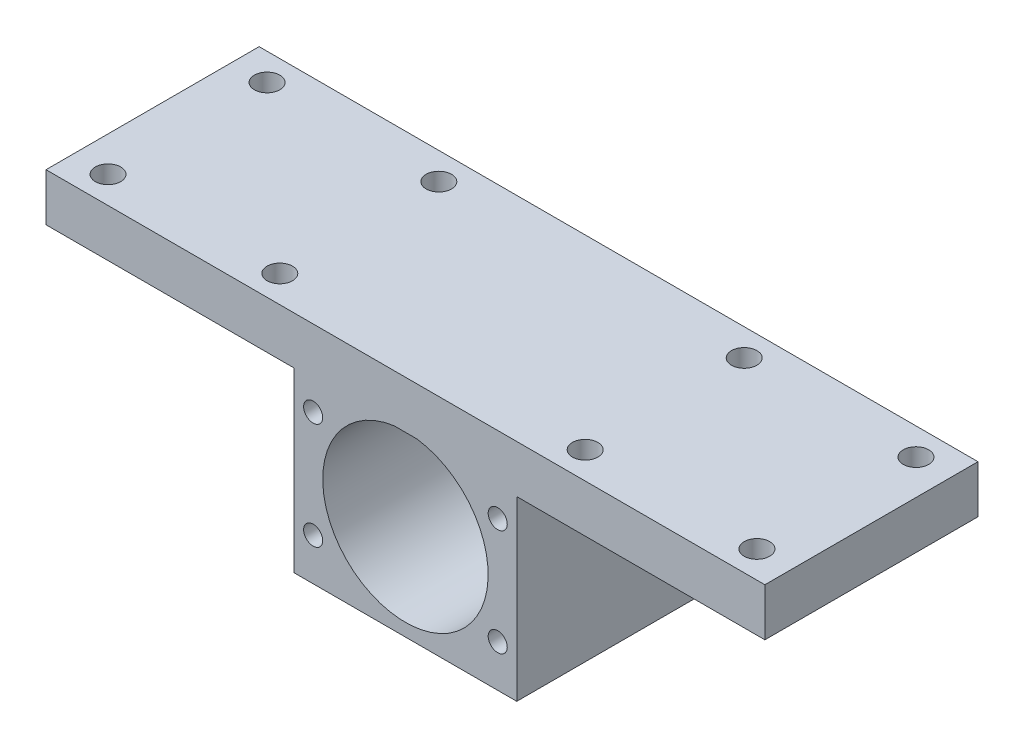
ISO-10303-21;
HEADER;
FILE_DESCRIPTION(('STEP AP214'),'2;1');
FILE_NAME('part.step','',(''),(''),'','','');
FILE_SCHEMA(('AUTOMOTIVE_DESIGN { 1 0 10303 214 1 1 1 1 }'));
ENDSEC;
DATA;
#1=APPLICATION_CONTEXT('core data for automotive mechanical design processes');
#2=APPLICATION_PROTOCOL_DEFINITION('international standard','automotive_design',2000,#1);
#3=PRODUCT_CONTEXT('',#1,'mechanical');
#4=PRODUCT('Part','Part','',(#3));
#5=PRODUCT_RELATED_PRODUCT_CATEGORY('part','',(#4));
#6=PRODUCT_DEFINITION_FORMATION('','',#4);
#7=PRODUCT_DEFINITION_CONTEXT('part definition',#1,'design');
#8=PRODUCT_DEFINITION('design','',#6,#7);
#9=PRODUCT_DEFINITION_SHAPE('','',#8);
#10=(LENGTH_UNIT() NAMED_UNIT(*) SI_UNIT(.MILLI.,.METRE.));
#11=(NAMED_UNIT(*) PLANE_ANGLE_UNIT() SI_UNIT($,.RADIAN.));
#12=(NAMED_UNIT(*) SI_UNIT($,.STERADIAN.) SOLID_ANGLE_UNIT());
#13=UNCERTAINTY_MEASURE_WITH_UNIT(LENGTH_MEASURE(1.E-05),#10,'distance_accuracy_value','');
#14=(GEOMETRIC_REPRESENTATION_CONTEXT(3) GLOBAL_UNCERTAINTY_ASSIGNED_CONTEXT((#13)) GLOBAL_UNIT_ASSIGNED_CONTEXT((#10,
#11,#12)) REPRESENTATION_CONTEXT('',''));
#15=CARTESIAN_POINT('',(0.,0.,0.));
#16=DIRECTION('',(0.,0.,1.));
#17=DIRECTION('',(1.,0.,0.));
#18=AXIS2_PLACEMENT_3D('',#15,#16,#17);
#19=CARTESIAN_POINT('',(0.,0.,0.));
#20=DIRECTION('',(0.,1.,0.));
#21=DIRECTION('',(0.,0.,1.));
#22=AXIS2_PLACEMENT_3D('',#19,#20,#21);
#23=PLANE('',#22);
#24=DIRECTION('',(0.,0.,1.));
#25=VECTOR('',#24,1.);
#26=CARTESIAN_POINT('',(-3.59687364248458,0.,-125.695444572929));
#27=LINE('',#26,#25);
#28=CARTESIAN_POINT('',(-3.59687364248458,0.,-33.5));
#29=VERTEX_POINT('',#28);
#30=CARTESIAN_POINT('',(-3.59687364248458,0.,33.5));
#31=VERTEX_POINT('',#30);
#32=EDGE_CURVE('E11',#29,#31,#27,.T.);
#33=ORIENTED_EDGE('',*,*,#32,.F.);
#34=DIRECTION('',(1.,0.,0.));
#35=VECTOR('',#34,1.);
#36=CARTESIAN_POINT('',(0.,0.,-33.5));
#37=LINE('',#36,#35);
#38=CARTESIAN_POINT('',(3.59687364248458,0.,-33.5));
#39=VERTEX_POINT('',#38);
#40=EDGE_CURVE('E58',#29,#39,#37,.T.);
#41=ORIENTED_EDGE('',*,*,#40,.T.);
#42=DIRECTION('',(0.,0.,1.));
#43=VECTOR('',#42,1.);
#44=CARTESIAN_POINT('',(3.59687364248458,0.,-125.695444572929));
#45=LINE('',#44,#43);
#46=CARTESIAN_POINT('',(3.59687364248458,0.,33.5));
#47=VERTEX_POINT('',#46);
#48=EDGE_CURVE('E51',#47,#39,#45,.F.);
#49=ORIENTED_EDGE('',*,*,#48,.F.);
#50=DIRECTION('',(-1.,0.,0.));
#51=VECTOR('',#50,1.);
#52=CARTESIAN_POINT('',(0.,0.,33.5));
#53=LINE('',#52,#51);
#54=EDGE_CURVE('E246',#47,#31,#53,.T.);
#55=ORIENTED_EDGE('',*,*,#54,.T.);
#56=EDGE_LOOP('',(#33,#41,#49,#55));
#57=FACE_BOUND('',#56,.T.);
#58=ADVANCED_FACE('F43',(#57),#23,.F.);
#59=CARTESIAN_POINT('',(102.,0.,-25.));
#60=DIRECTION('',(0.,1.,0.));
#61=DIRECTION('',(0.,0.,1.));
#62=AXIS2_PLACEMENT_3D('',#59,#60,#61);
#63=CIRCLE('',#62,3.99999999999999);
#64=CARTESIAN_POINT('',(102.,0.,-21.));
#65=VERTEX_POINT('',#64);
#66=EDGE_CURVE('E192',#65,#65,#63,.F.);
#67=ORIENTED_EDGE('',*,*,#66,.F.);
#68=EDGE_LOOP('',(#67));
#69=FACE_BOUND('',#68,.T.);
#70=CARTESIAN_POINT('',(102.,0.,25.));
#71=DIRECTION('',(0.,1.,0.));
#72=DIRECTION('',(0.,0.,1.));
#73=AXIS2_PLACEMENT_3D('',#70,#71,#72);
#74=CIRCLE('',#73,3.99999999999999);
#75=CARTESIAN_POINT('',(102.,0.,29.));
#76=VERTEX_POINT('',#75);
#77=EDGE_CURVE('E253',#76,#76,#74,.F.);
#78=ORIENTED_EDGE('',*,*,#77,.F.);
#79=EDGE_LOOP('',(#78));
#80=FACE_BOUND('',#79,.T.);
#81=CARTESIAN_POINT('',(48.,0.,25.));
#82=DIRECTION('',(0.,1.,0.));
#83=DIRECTION('',(0.,0.,1.));
#84=AXIS2_PLACEMENT_3D('',#81,#82,#83);
#85=CIRCLE('',#84,4.00000000000001);
#86=CARTESIAN_POINT('',(48.,0.,29.));
#87=VERTEX_POINT('',#86);
#88=EDGE_CURVE('E227',#87,#87,#85,.F.);
#89=ORIENTED_EDGE('',*,*,#88,.F.);
#90=EDGE_LOOP('',(#89));
#91=FACE_BOUND('',#90,.T.);
#92=CARTESIAN_POINT('',(48.,0.,-25.));
#93=DIRECTION('',(0.,1.,0.));
#94=DIRECTION('',(0.,0.,1.));
#95=AXIS2_PLACEMENT_3D('',#92,#93,#94);
#96=CIRCLE('',#95,4.00000000000001);
#97=CARTESIAN_POINT('',(48.,0.,-21.));
#98=VERTEX_POINT('',#97);
#99=EDGE_CURVE('E166',#98,#98,#96,.F.);
#100=ORIENTED_EDGE('',*,*,#99,.F.);
#101=EDGE_LOOP('',(#100));
#102=FACE_BOUND('',#101,.T.);
#103=DIRECTION('',(0.,0.,1.));
#104=VECTOR('',#103,1.);
#105=CARTESIAN_POINT('',(35.,0.,0.));
#106=LINE('',#105,#104);
#107=CARTESIAN_POINT('',(35.,0.,-33.5));
#108=VERTEX_POINT('',#107);
#109=CARTESIAN_POINT('',(35.,0.,33.5));
#110=VERTEX_POINT('',#109);
#111=EDGE_CURVE('E266',#108,#110,#106,.T.);
#112=ORIENTED_EDGE('',*,*,#111,.F.);
#113=CARTESIAN_POINT('',(113.,0.,-33.5));
#114=VERTEX_POINT('',#113);
#115=EDGE_CURVE('E130',#108,#114,#37,.T.);
#116=ORIENTED_EDGE('',*,*,#115,.T.);
#117=DIRECTION('',(0.,0.,1.));
#118=VECTOR('',#117,1.);
#119=CARTESIAN_POINT('',(113.,0.,0.));
#120=LINE('',#119,#118);
#121=CARTESIAN_POINT('',(113.,0.,33.5));
#122=VERTEX_POINT('',#121);
#123=EDGE_CURVE('E245',#114,#122,#120,.T.);
#124=ORIENTED_EDGE('',*,*,#123,.T.);
#125=EDGE_CURVE('E243',#122,#110,#53,.T.);
#126=ORIENTED_EDGE('',*,*,#125,.T.);
#127=EDGE_LOOP('',(#112,#116,#124,#126));
#128=FACE_BOUND('',#127,.T.);
#129=ADVANCED_FACE('F293',(#69,#80,#91,#102,#128),#23,.F.);
#130=CARTESIAN_POINT('',(0.,15.,33.5));
#131=DIRECTION('',(0.,0.,1.));
#132=DIRECTION('',(1.,0.,0.));
#133=AXIS2_PLACEMENT_3D('',#130,#131,#132);
#134=PLANE('',#133);
#135=CARTESIAN_POINT('',(-35.,0.,33.5));
#136=VERTEX_POINT('',#135);
#137=CARTESIAN_POINT('',(-113.,0.,33.5));
#138=VERTEX_POINT('',#137);
#139=EDGE_CURVE('E242',#136,#138,#53,.T.);
#140=ORIENTED_EDGE('',*,*,#139,.F.);
#141=DIRECTION('',(0.,-1.,0.));
#142=VECTOR('',#141,1.);
#143=CARTESIAN_POINT('',(-35.,0.,33.5));
#144=LINE('',#143,#142);
#145=CARTESIAN_POINT('',(-35.,-55.75,33.5));
#146=VERTEX_POINT('',#145);
#147=EDGE_CURVE('E181',#136,#146,#144,.T.);
#148=ORIENTED_EDGE('',*,*,#147,.T.);
#149=DIRECTION('',(1.,0.,0.));
#150=VECTOR('',#149,1.);
#151=CARTESIAN_POINT('',(0.,-55.75,33.5));
#152=LINE('',#151,#150);
#153=CARTESIAN_POINT('',(35.,-55.75,33.5));
#154=VERTEX_POINT('',#153);
#155=EDGE_CURVE('E183',#146,#154,#152,.T.);
#156=ORIENTED_EDGE('',*,*,#155,.T.);
#157=DIRECTION('',(0.,-1.,0.));
#158=VECTOR('',#157,1.);
#159=CARTESIAN_POINT('',(35.,0.,33.5));
#160=LINE('',#159,#158);
#161=EDGE_CURVE('E140',#110,#154,#160,.T.);
#162=ORIENTED_EDGE('',*,*,#161,.F.);
#163=ORIENTED_EDGE('',*,*,#125,.F.);
#164=DIRECTION('',(0.,-1.,0.));
#165=VECTOR('',#164,1.);
#166=CARTESIAN_POINT('',(113.,15.,33.5));
#167=LINE('',#166,#165);
#168=CARTESIAN_POINT('',(113.,15.,33.5));
#169=VERTEX_POINT('',#168);
#170=EDGE_CURVE('E264',#169,#122,#167,.T.);
#171=ORIENTED_EDGE('',*,*,#170,.F.);
#172=DIRECTION('',(-1.,0.,0.));
#173=VECTOR('',#172,1.);
#174=CARTESIAN_POINT('',(0.,15.,33.5));
#175=LINE('',#174,#173);
#176=CARTESIAN_POINT('',(-113.,15.,33.5));
#177=VERTEX_POINT('',#176);
#178=EDGE_CURVE('E207',#169,#177,#175,.T.);
#179=ORIENTED_EDGE('',*,*,#178,.T.);
#180=DIRECTION('',(0.,-1.,0.));
#181=VECTOR('',#180,1.);
#182=CARTESIAN_POINT('',(-113.,15.,33.5));
#183=LINE('',#182,#181);
#184=EDGE_CURVE('E224',#177,#138,#183,.T.);
#185=ORIENTED_EDGE('',*,*,#184,.T.);
#186=EDGE_LOOP('',(#140,#148,#156,#162,#163,#171,#179,#185));
#187=FACE_BOUND('',#186,.T.);
#188=CARTESIAN_POINT('',(0.,-25.75,33.5));
#189=DIRECTION('',(0.,0.,1.));
#190=DIRECTION('',(1.,0.,0.));
#191=AXIS2_PLACEMENT_3D('',#188,#189,#190);
#192=CIRCLE('',#191,26.);
#193=EDGE_CURVE('E134',#31,#47,#192,.T.);
#194=ORIENTED_EDGE('',*,*,#193,.F.);
#195=ORIENTED_EDGE('',*,*,#54,.F.);
#196=EDGE_LOOP('',(#194,#195));
#197=FACE_BOUND('',#196,.T.);
#198=CARTESIAN_POINT('',(-29.0118510267788,-9.00000000000019,33.5));
#199=DIRECTION('',(0.,0.,1.));
#200=DIRECTION('',(1.,0.,0.));
#201=AXIS2_PLACEMENT_3D('',#198,#199,#200);
#202=CIRCLE('',#201,3.);
#203=CARTESIAN_POINT('',(-26.0118510267788,-9.00000000000019,33.5));
#204=VERTEX_POINT('',#203);
#205=EDGE_CURVE('E178',#204,#204,#202,.T.);
#206=ORIENTED_EDGE('',*,*,#205,.F.);
#207=EDGE_LOOP('',(#206));
#208=FACE_BOUND('',#207,.T.);
#209=CARTESIAN_POINT('',(-29.0118510267788,-42.4999999999998,33.5));
#210=DIRECTION('',(0.,0.,1.));
#211=DIRECTION('',(1.,0.,0.));
#212=AXIS2_PLACEMENT_3D('',#209,#210,#211);
#213=CIRCLE('',#212,3.);
#214=CARTESIAN_POINT('',(-26.0118510267788,-42.4999999999998,33.5));
#215=VERTEX_POINT('',#214);
#216=EDGE_CURVE('E175',#215,#215,#213,.T.);
#217=ORIENTED_EDGE('',*,*,#216,.F.);
#218=EDGE_LOOP('',(#217));
#219=FACE_BOUND('',#218,.T.);
#220=CARTESIAN_POINT('',(29.0118510267788,-42.4999999999998,33.5));
#221=DIRECTION('',(0.,0.,1.));
#222=DIRECTION('',(1.,0.,0.));
#223=AXIS2_PLACEMENT_3D('',#220,#221,#222);
#224=CIRCLE('',#223,3.);
#225=CARTESIAN_POINT('',(32.0118510267788,-42.4999999999998,33.5));
#226=VERTEX_POINT('',#225);
#227=EDGE_CURVE('E172',#226,#226,#224,.T.);
#228=ORIENTED_EDGE('',*,*,#227,.F.);
#229=EDGE_LOOP('',(#228));
#230=FACE_BOUND('',#229,.T.);
#231=CARTESIAN_POINT('',(29.0118510267788,-9.00000000000018,33.5));
#232=DIRECTION('',(0.,0.,1.));
#233=DIRECTION('',(1.,0.,0.));
#234=AXIS2_PLACEMENT_3D('',#231,#232,#233);
#235=CIRCLE('',#234,3.);
#236=CARTESIAN_POINT('',(32.0118510267788,-9.00000000000018,33.5));
#237=VERTEX_POINT('',#236);
#238=EDGE_CURVE('E169',#237,#237,#235,.T.);
#239=ORIENTED_EDGE('',*,*,#238,.F.);
#240=EDGE_LOOP('',(#239));
#241=FACE_BOUND('',#240,.T.);
#242=ADVANCED_FACE('F276',(#187,#197,#208,#219,#230,#241),#134,.T.);
#243=CARTESIAN_POINT('',(113.,15.,0.));
#244=DIRECTION('',(1.,0.,0.));
#245=DIRECTION('',(0.,0.,-1.));
#246=AXIS2_PLACEMENT_3D('',#243,#244,#245);
#247=PLANE('',#246);
#248=ORIENTED_EDGE('',*,*,#123,.F.);
#249=DIRECTION('',(0.,-1.,0.));
#250=VECTOR('',#249,1.);
#251=CARTESIAN_POINT('',(113.,15.,-33.5));
#252=LINE('',#251,#250);
#253=CARTESIAN_POINT('',(113.,15.,-33.5));
#254=VERTEX_POINT('',#253);
#255=EDGE_CURVE('E262',#254,#114,#252,.T.);
#256=ORIENTED_EDGE('',*,*,#255,.F.);
#257=DIRECTION('',(0.,0.,1.));
#258=VECTOR('',#257,1.);
#259=CARTESIAN_POINT('',(113.,15.,0.));
#260=LINE('',#259,#258);
#261=EDGE_CURVE('E210',#254,#169,#260,.T.);
#262=ORIENTED_EDGE('',*,*,#261,.T.);
#263=ORIENTED_EDGE('',*,*,#170,.T.);
#264=EDGE_LOOP('',(#248,#256,#262,#263));
#265=FACE_BOUND('',#264,.T.);
#266=ADVANCED_FACE('F295',(#265),#247,.T.);
#267=CARTESIAN_POINT('',(0.,15.,-33.5));
#268=DIRECTION('',(0.,0.,-1.));
#269=DIRECTION('',(-1.,0.,0.));
#270=AXIS2_PLACEMENT_3D('',#267,#268,#269);
#271=PLANE('',#270);
#272=DIRECTION('',(0.,-1.,0.));
#273=VECTOR('',#272,1.);
#274=CARTESIAN_POINT('',(-35.,0.,-33.5));
#275=LINE('',#274,#273);
#276=CARTESIAN_POINT('',(-35.,0.,-33.5));
#277=VERTEX_POINT('',#276);
#278=CARTESIAN_POINT('',(-35.,-55.75,-33.5));
#279=VERTEX_POINT('',#278);
#280=EDGE_CURVE('E144',#277,#279,#275,.T.);
#281=ORIENTED_EDGE('',*,*,#280,.F.);
#282=CARTESIAN_POINT('',(-113.,0.,-33.5));
#283=VERTEX_POINT('',#282);
#284=EDGE_CURVE('E66',#283,#277,#37,.T.);
#285=ORIENTED_EDGE('',*,*,#284,.F.);
#286=DIRECTION('',(0.,-1.,0.));
#287=VECTOR('',#286,1.);
#288=CARTESIAN_POINT('',(-113.,15.,-33.5));
#289=LINE('',#288,#287);
#290=CARTESIAN_POINT('',(-113.,15.,-33.5));
#291=VERTEX_POINT('',#290);
#292=EDGE_CURVE('E260',#291,#283,#289,.T.);
#293=ORIENTED_EDGE('',*,*,#292,.F.);
#294=DIRECTION('',(1.,0.,0.));
#295=VECTOR('',#294,1.);
#296=CARTESIAN_POINT('',(0.,15.,-33.5));
#297=LINE('',#296,#295);
#298=EDGE_CURVE('E213',#291,#254,#297,.T.);
#299=ORIENTED_EDGE('',*,*,#298,.T.);
#300=ORIENTED_EDGE('',*,*,#255,.T.);
#301=ORIENTED_EDGE('',*,*,#115,.F.);
#302=DIRECTION('',(0.,-1.,0.));
#303=VECTOR('',#302,1.);
#304=CARTESIAN_POINT('',(35.,0.,-33.5));
#305=LINE('',#304,#303);
#306=CARTESIAN_POINT('',(35.,-55.75,-33.5));
#307=VERTEX_POINT('',#306);
#308=EDGE_CURVE('E121',#108,#307,#305,.T.);
#309=ORIENTED_EDGE('',*,*,#308,.T.);
#310=DIRECTION('',(1.,0.,0.));
#311=VECTOR('',#310,1.);
#312=CARTESIAN_POINT('',(0.,-55.75,-33.5));
#313=LINE('',#312,#311);
#314=EDGE_CURVE('E127',#279,#307,#313,.T.);
#315=ORIENTED_EDGE('',*,*,#314,.F.);
#316=EDGE_LOOP('',(#281,#285,#293,#299,#300,#301,#309,#315));
#317=FACE_BOUND('',#316,.T.);
#318=CARTESIAN_POINT('',(0.,-25.75,-33.5));
#319=DIRECTION('',(0.,0.,-1.));
#320=DIRECTION('',(-1.,0.,0.));
#321=AXIS2_PLACEMENT_3D('',#318,#319,#320);
#322=CIRCLE('',#321,26.);
#323=EDGE_CURVE('E151',#29,#39,#322,.F.);
#324=ORIENTED_EDGE('',*,*,#323,.T.);
#325=ORIENTED_EDGE('',*,*,#40,.F.);
#326=EDGE_LOOP('',(#324,#325));
#327=FACE_BOUND('',#326,.T.);
#328=CARTESIAN_POINT('',(-29.0118510267788,-9.00000000000019,-33.5));
#329=DIRECTION('',(0.,0.,-1.));
#330=DIRECTION('',(-1.,0.,0.));
#331=AXIS2_PLACEMENT_3D('',#328,#329,#330);
#332=CIRCLE('',#331,3.);
#333=CARTESIAN_POINT('',(-32.0118510267788,-9.00000000000019,-33.5));
#334=VERTEX_POINT('',#333);
#335=EDGE_CURVE('E163',#334,#334,#332,.F.);
#336=ORIENTED_EDGE('',*,*,#335,.T.);
#337=EDGE_LOOP('',(#336));
#338=FACE_BOUND('',#337,.T.);
#339=CARTESIAN_POINT('',(29.0118510267788,-42.4999999999998,-33.5));
#340=DIRECTION('',(0.,0.,-1.));
#341=DIRECTION('',(-1.,0.,0.));
#342=AXIS2_PLACEMENT_3D('',#339,#340,#341);
#343=CIRCLE('',#342,3.);
#344=CARTESIAN_POINT('',(26.0118510267788,-42.4999999999998,-33.5));
#345=VERTEX_POINT('',#344);
#346=EDGE_CURVE('E157',#345,#345,#343,.F.);
#347=ORIENTED_EDGE('',*,*,#346,.T.);
#348=EDGE_LOOP('',(#347));
#349=FACE_BOUND('',#348,.T.);
#350=CARTESIAN_POINT('',(29.0118510267788,-9.00000000000018,-33.5));
#351=DIRECTION('',(0.,0.,-1.));
#352=DIRECTION('',(-1.,0.,0.));
#353=AXIS2_PLACEMENT_3D('',#350,#351,#352);
#354=CIRCLE('',#353,3.);
#355=CARTESIAN_POINT('',(26.0118510267788,-9.00000000000018,-33.5));
#356=VERTEX_POINT('',#355);
#357=EDGE_CURVE('E154',#356,#356,#354,.F.);
#358=ORIENTED_EDGE('',*,*,#357,.T.);
#359=EDGE_LOOP('',(#358));
#360=FACE_BOUND('',#359,.T.);
#361=CARTESIAN_POINT('',(-29.0118510267788,-42.4999999999998,-33.5));
#362=DIRECTION('',(0.,0.,-1.));
#363=DIRECTION('',(-1.,0.,0.));
#364=AXIS2_PLACEMENT_3D('',#361,#362,#363);
#365=CIRCLE('',#364,3.);
#366=CARTESIAN_POINT('',(-32.0118510267788,-42.4999999999998,-33.5));
#367=VERTEX_POINT('',#366);
#368=EDGE_CURVE('E160',#367,#367,#365,.F.);
#369=ORIENTED_EDGE('',*,*,#368,.T.);
#370=EDGE_LOOP('',(#369));
#371=FACE_BOUND('',#370,.T.);
#372=ADVANCED_FACE('F124',(#317,#327,#338,#349,#360,#371),#271,.T.);
#373=CARTESIAN_POINT('',(102.,15.,25.));
#374=DIRECTION('',(0.,-1.,0.));
#375=DIRECTION('',(0.,0.,-1.));
#376=AXIS2_PLACEMENT_3D('',#373,#374,#375);
#377=CYLINDRICAL_SURFACE('',#376,3.99999999999999);
#378=CARTESIAN_POINT('',(102.,15.,25.));
#379=DIRECTION('',(0.,1.,0.));
#380=DIRECTION('',(0.,0.,1.));
#381=AXIS2_PLACEMENT_3D('',#378,#379,#380);
#382=CIRCLE('',#381,3.99999999999999);
#383=CARTESIAN_POINT('',(102.,15.,29.));
#384=VERTEX_POINT('',#383);
#385=EDGE_CURVE('E218',#384,#384,#382,.F.);
#386=ORIENTED_EDGE('',*,*,#385,.F.);
#387=EDGE_LOOP('',(#386));
#388=FACE_BOUND('',#387,.T.);
#389=ORIENTED_EDGE('',*,*,#77,.T.);
#390=EDGE_LOOP('',(#389));
#391=FACE_BOUND('',#390,.T.);
#392=ADVANCED_FACE('F361',(#388,#391),#377,.F.);
#393=CARTESIAN_POINT('',(-113.,15.,0.));
#394=DIRECTION('',(1.,0.,0.));
#395=DIRECTION('',(0.,0.,-1.));
#396=AXIS2_PLACEMENT_3D('',#393,#394,#395);
#397=PLANE('',#396);
#398=DIRECTION('',(0.,0.,1.));
#399=VECTOR('',#398,1.);
#400=CARTESIAN_POINT('',(-113.,0.,0.));
#401=LINE('',#400,#399);
#402=EDGE_CURVE('E250',#283,#138,#401,.T.);
#403=ORIENTED_EDGE('',*,*,#402,.T.);
#404=ORIENTED_EDGE('',*,*,#184,.F.);
#405=DIRECTION('',(0.,0.,1.));
#406=VECTOR('',#405,1.);
#407=CARTESIAN_POINT('',(-113.,15.,0.));
#408=LINE('',#407,#406);
#409=EDGE_CURVE('E216',#291,#177,#408,.T.);
#410=ORIENTED_EDGE('',*,*,#409,.F.);
#411=ORIENTED_EDGE('',*,*,#292,.T.);
#412=EDGE_LOOP('',(#403,#404,#410,#411));
#413=FACE_BOUND('',#412,.T.);
#414=ADVANCED_FACE('F286',(#413),#397,.F.);
#415=CARTESIAN_POINT('',(-102.,15.,-25.));
#416=DIRECTION('',(0.,-1.,0.));
#417=DIRECTION('',(0.,0.,-1.));
#418=AXIS2_PLACEMENT_3D('',#415,#416,#417);
#419=CYLINDRICAL_SURFACE('',#418,3.99999999999999);
#420=CARTESIAN_POINT('',(-102.,15.,-25.));
#421=DIRECTION('',(0.,1.,0.));
#422=DIRECTION('',(0.,0.,1.));
#423=AXIS2_PLACEMENT_3D('',#420,#421,#422);
#424=CIRCLE('',#423,3.99999999999999);
#425=CARTESIAN_POINT('',(-102.,15.,-21.));
#426=VERTEX_POINT('',#425);
#427=EDGE_CURVE('E204',#426,#426,#424,.T.);
#428=ORIENTED_EDGE('',*,*,#427,.T.);
#429=EDGE_LOOP('',(#428));
#430=FACE_BOUND('',#429,.T.);
#431=CARTESIAN_POINT('',(-102.,0.,-25.));
#432=DIRECTION('',(0.,1.,0.));
#433=DIRECTION('',(0.,0.,1.));
#434=AXIS2_PLACEMENT_3D('',#431,#432,#433);
#435=CIRCLE('',#434,3.99999999999999);
#436=CARTESIAN_POINT('',(-102.,0.,-21.));
#437=VERTEX_POINT('',#436);
#438=EDGE_CURVE('E239',#437,#437,#435,.T.);
#439=ORIENTED_EDGE('',*,*,#438,.F.);
#440=EDGE_LOOP('',(#439));
#441=FACE_BOUND('',#440,.T.);
#442=ADVANCED_FACE('F349',(#430,#441),#419,.F.);
#443=CARTESIAN_POINT('',(-48.,15.,-25.));
#444=DIRECTION('',(0.,-1.,0.));
#445=DIRECTION('',(0.,0.,-1.));
#446=AXIS2_PLACEMENT_3D('',#443,#444,#445);
#447=CYLINDRICAL_SURFACE('',#446,4.00000000000001);
#448=CARTESIAN_POINT('',(-48.,15.,-25.));
#449=DIRECTION('',(0.,1.,0.));
#450=DIRECTION('',(0.,0.,1.));
#451=AXIS2_PLACEMENT_3D('',#448,#449,#450);
#452=CIRCLE('',#451,4.00000000000001);
#453=CARTESIAN_POINT('',(-48.,15.,-21.));
#454=VERTEX_POINT('',#453);
#455=EDGE_CURVE('E201',#454,#454,#452,.T.);
#456=ORIENTED_EDGE('',*,*,#455,.T.);
#457=EDGE_LOOP('',(#456));
#458=FACE_BOUND('',#457,.T.);
#459=CARTESIAN_POINT('',(-48.,0.,-25.));
#460=DIRECTION('',(0.,1.,0.));
#461=DIRECTION('',(0.,0.,1.));
#462=AXIS2_PLACEMENT_3D('',#459,#460,#461);
#463=CIRCLE('',#462,4.00000000000001);
#464=CARTESIAN_POINT('',(-48.,0.,-21.));
#465=VERTEX_POINT('',#464);
#466=EDGE_CURVE('E236',#465,#465,#463,.T.);
#467=ORIENTED_EDGE('',*,*,#466,.F.);
#468=EDGE_LOOP('',(#467));
#469=FACE_BOUND('',#468,.T.);
#470=ADVANCED_FACE('F351',(#458,#469),#447,.F.);
#471=CARTESIAN_POINT('',(-102.,15.,25.));
#472=DIRECTION('',(0.,-1.,0.));
#473=DIRECTION('',(0.,0.,-1.));
#474=AXIS2_PLACEMENT_3D('',#471,#472,#473);
#475=CYLINDRICAL_SURFACE('',#474,3.99999999999999);
#476=CARTESIAN_POINT('',(-102.,15.,25.));
#477=DIRECTION('',(0.,1.,0.));
#478=DIRECTION('',(0.,0.,1.));
#479=AXIS2_PLACEMENT_3D('',#476,#477,#478);
#480=CIRCLE('',#479,3.99999999999999);
#481=CARTESIAN_POINT('',(-102.,15.,29.));
#482=VERTEX_POINT('',#481);
#483=EDGE_CURVE('E198',#482,#482,#480,.T.);
#484=ORIENTED_EDGE('',*,*,#483,.T.);
#485=EDGE_LOOP('',(#484));
#486=FACE_BOUND('',#485,.T.);
#487=CARTESIAN_POINT('',(-102.,0.,25.));
#488=DIRECTION('',(0.,1.,0.));
#489=DIRECTION('',(0.,0.,1.));
#490=AXIS2_PLACEMENT_3D('',#487,#488,#489);
#491=CIRCLE('',#490,3.99999999999999);
#492=CARTESIAN_POINT('',(-102.,0.,29.));
#493=VERTEX_POINT('',#492);
#494=EDGE_CURVE('E233',#493,#493,#491,.T.);
#495=ORIENTED_EDGE('',*,*,#494,.F.);
#496=EDGE_LOOP('',(#495));
#497=FACE_BOUND('',#496,.T.);
#498=ADVANCED_FACE('F358',(#486,#497),#475,.F.);
#499=CARTESIAN_POINT('',(-48.,15.,25.));
#500=DIRECTION('',(0.,-1.,0.));
#501=DIRECTION('',(0.,0.,-1.));
#502=AXIS2_PLACEMENT_3D('',#499,#500,#501);
#503=CYLINDRICAL_SURFACE('',#502,4.00000000000001);
#504=CARTESIAN_POINT('',(-48.,15.,25.));
#505=DIRECTION('',(0.,1.,0.));
#506=DIRECTION('',(0.,0.,1.));
#507=AXIS2_PLACEMENT_3D('',#504,#505,#506);
#508=CIRCLE('',#507,4.00000000000001);
#509=CARTESIAN_POINT('',(-48.,15.,29.));
#510=VERTEX_POINT('',#509);
#511=EDGE_CURVE('E195',#510,#510,#508,.T.);
#512=ORIENTED_EDGE('',*,*,#511,.T.);
#513=EDGE_LOOP('',(#512));
#514=FACE_BOUND('',#513,.T.);
#515=CARTESIAN_POINT('',(-48.,0.,25.));
#516=DIRECTION('',(0.,1.,0.));
#517=DIRECTION('',(0.,0.,1.));
#518=AXIS2_PLACEMENT_3D('',#515,#516,#517);
#519=CIRCLE('',#518,4.00000000000001);
#520=CARTESIAN_POINT('',(-48.,0.,29.));
#521=VERTEX_POINT('',#520);
#522=EDGE_CURVE('E230',#521,#521,#519,.T.);
#523=ORIENTED_EDGE('',*,*,#522,.F.);
#524=EDGE_LOOP('',(#523));
#525=FACE_BOUND('',#524,.T.);
#526=ADVANCED_FACE('F328',(#514,#525),#503,.F.);
#527=CARTESIAN_POINT('',(48.,15.,25.));
#528=DIRECTION('',(0.,-1.,0.));
#529=DIRECTION('',(0.,0.,-1.));
#530=AXIS2_PLACEMENT_3D('',#527,#528,#529);
#531=CYLINDRICAL_SURFACE('',#530,4.00000000000001);
#532=CARTESIAN_POINT('',(48.,15.,25.));
#533=DIRECTION('',(0.,1.,0.));
#534=DIRECTION('',(0.,0.,1.));
#535=AXIS2_PLACEMENT_3D('',#532,#533,#534);
#536=CIRCLE('',#535,4.00000000000001);
#537=CARTESIAN_POINT('',(48.,15.,29.));
#538=VERTEX_POINT('',#537);
#539=EDGE_CURVE('E191',#538,#538,#536,.F.);
#540=ORIENTED_EDGE('',*,*,#539,.F.);
#541=EDGE_LOOP('',(#540));
#542=FACE_BOUND('',#541,.T.);
#543=ORIENTED_EDGE('',*,*,#88,.T.);
#544=EDGE_LOOP('',(#543));
#545=FACE_BOUND('',#544,.T.);
#546=ADVANCED_FACE('F323',(#542,#545),#531,.F.);
#547=CARTESIAN_POINT('',(48.,15.,-25.));
#548=DIRECTION('',(0.,-1.,0.));
#549=DIRECTION('',(0.,0.,-1.));
#550=AXIS2_PLACEMENT_3D('',#547,#548,#549);
#551=CYLINDRICAL_SURFACE('',#550,4.00000000000001);
#552=CARTESIAN_POINT('',(48.,15.,-25.));
#553=DIRECTION('',(0.,1.,0.));
#554=DIRECTION('',(0.,0.,1.));
#555=AXIS2_PLACEMENT_3D('',#552,#553,#554);
#556=CIRCLE('',#555,4.00000000000001);
#557=CARTESIAN_POINT('',(48.,15.,-21.));
#558=VERTEX_POINT('',#557);
#559=EDGE_CURVE('E188',#558,#558,#556,.F.);
#560=ORIENTED_EDGE('',*,*,#559,.F.);
#561=EDGE_LOOP('',(#560));
#562=FACE_BOUND('',#561,.T.);
#563=ORIENTED_EDGE('',*,*,#99,.T.);
#564=EDGE_LOOP('',(#563));
#565=FACE_BOUND('',#564,.T.);
#566=ADVANCED_FACE('F45',(#562,#565),#551,.F.);
#567=CARTESIAN_POINT('',(102.,15.,-25.));
#568=DIRECTION('',(0.,-1.,0.));
#569=DIRECTION('',(0.,0.,-1.));
#570=AXIS2_PLACEMENT_3D('',#567,#568,#569);
#571=CYLINDRICAL_SURFACE('',#570,3.99999999999999);
#572=CARTESIAN_POINT('',(102.,15.,-25.));
#573=DIRECTION('',(0.,1.,0.));
#574=DIRECTION('',(0.,0.,1.));
#575=AXIS2_PLACEMENT_3D('',#572,#573,#574);
#576=CIRCLE('',#575,3.99999999999999);
#577=CARTESIAN_POINT('',(102.,15.,-21.));
#578=VERTEX_POINT('',#577);
#579=EDGE_CURVE('E221',#578,#578,#576,.F.);
#580=ORIENTED_EDGE('',*,*,#579,.F.);
#581=EDGE_LOOP('',(#580));
#582=FACE_BOUND('',#581,.T.);
#583=ORIENTED_EDGE('',*,*,#66,.T.);
#584=EDGE_LOOP('',(#583));
#585=FACE_BOUND('',#584,.T.);
#586=ADVANCED_FACE('F301',(#582,#585),#571,.F.);
#587=CARTESIAN_POINT('',(0.,15.,0.));
#588=DIRECTION('',(0.,1.,0.));
#589=DIRECTION('',(0.,0.,1.));
#590=AXIS2_PLACEMENT_3D('',#587,#588,#589);
#591=PLANE('',#590);
#592=ORIENTED_EDGE('',*,*,#559,.T.);
#593=EDGE_LOOP('',(#592));
#594=FACE_BOUND('',#593,.T.);
#595=ORIENTED_EDGE('',*,*,#539,.T.);
#596=EDGE_LOOP('',(#595));
#597=FACE_BOUND('',#596,.T.);
#598=ORIENTED_EDGE('',*,*,#511,.F.);
#599=EDGE_LOOP('',(#598));
#600=FACE_BOUND('',#599,.T.);
#601=ORIENTED_EDGE('',*,*,#483,.F.);
#602=EDGE_LOOP('',(#601));
#603=FACE_BOUND('',#602,.T.);
#604=ORIENTED_EDGE('',*,*,#455,.F.);
#605=EDGE_LOOP('',(#604));
#606=FACE_BOUND('',#605,.T.);
#607=ORIENTED_EDGE('',*,*,#427,.F.);
#608=EDGE_LOOP('',(#607));
#609=FACE_BOUND('',#608,.T.);
#610=ORIENTED_EDGE('',*,*,#178,.F.);
#611=ORIENTED_EDGE('',*,*,#261,.F.);
#612=ORIENTED_EDGE('',*,*,#298,.F.);
#613=ORIENTED_EDGE('',*,*,#409,.T.);
#614=EDGE_LOOP('',(#610,#611,#612,#613));
#615=FACE_BOUND('',#614,.T.);
#616=ORIENTED_EDGE('',*,*,#385,.T.);
#617=EDGE_LOOP('',(#616));
#618=FACE_BOUND('',#617,.T.);
#619=ORIENTED_EDGE('',*,*,#579,.T.);
#620=EDGE_LOOP('',(#619));
#621=FACE_BOUND('',#620,.T.);
#622=ADVANCED_FACE('F298',(#594,#597,#600,#603,#606,#609,#615,#618,#621),#591,.T.);
#623=ORIENTED_EDGE('',*,*,#522,.T.);
#624=EDGE_LOOP('',(#623));
#625=FACE_BOUND('',#624,.T.);
#626=ORIENTED_EDGE('',*,*,#494,.T.);
#627=EDGE_LOOP('',(#626));
#628=FACE_BOUND('',#627,.T.);
#629=ORIENTED_EDGE('',*,*,#466,.T.);
#630=EDGE_LOOP('',(#629));
#631=FACE_BOUND('',#630,.T.);
#632=ORIENTED_EDGE('',*,*,#438,.T.);
#633=EDGE_LOOP('',(#632));
#634=FACE_BOUND('',#633,.T.);
#635=ORIENTED_EDGE('',*,*,#284,.T.);
#636=DIRECTION('',(0.,0.,1.));
#637=VECTOR('',#636,1.);
#638=CARTESIAN_POINT('',(-35.,0.,0.));
#639=LINE('',#638,#637);
#640=EDGE_CURVE('E268',#277,#136,#639,.T.);
#641=ORIENTED_EDGE('',*,*,#640,.T.);
#642=ORIENTED_EDGE('',*,*,#139,.T.);
#643=ORIENTED_EDGE('',*,*,#402,.F.);
#644=EDGE_LOOP('',(#635,#641,#642,#643));
#645=FACE_BOUND('',#644,.T.);
#646=ADVANCED_FACE('F279',(#625,#628,#631,#634,#645),#23,.F.);
#647=CARTESIAN_POINT('',(0.,-25.75,-125.695444572929));
#648=DIRECTION('',(0.,0.,1.));
#649=DIRECTION('',(1.,0.,0.));
#650=AXIS2_PLACEMENT_3D('',#647,#648,#649);
#651=CYLINDRICAL_SURFACE('',#650,26.);
#652=ORIENTED_EDGE('',*,*,#323,.F.);
#653=ORIENTED_EDGE('',*,*,#32,.T.);
#654=ORIENTED_EDGE('',*,*,#193,.T.);
#655=ORIENTED_EDGE('',*,*,#48,.T.);
#656=EDGE_LOOP('',(#652,#653,#654,#655));
#657=FACE_BOUND('',#656,.T.);
#658=ADVANCED_FACE('F271',(#657),#651,.F.);
#659=CARTESIAN_POINT('',(-35.,0.,-125.695444572929));
#660=DIRECTION('',(-1.,0.,0.));
#661=DIRECTION('',(0.,0.,1.));
#662=AXIS2_PLACEMENT_3D('',#659,#660,#661);
#663=PLANE('',#662);
#664=ORIENTED_EDGE('',*,*,#640,.F.);
#665=ORIENTED_EDGE('',*,*,#280,.T.);
#666=DIRECTION('',(0.,0.,1.));
#667=VECTOR('',#666,1.);
#668=CARTESIAN_POINT('',(-35.,-55.75,-125.695444572929));
#669=LINE('',#668,#667);
#670=EDGE_CURVE('E145',#279,#146,#669,.T.);
#671=ORIENTED_EDGE('',*,*,#670,.T.);
#672=ORIENTED_EDGE('',*,*,#147,.F.);
#673=EDGE_LOOP('',(#664,#665,#671,#672));
#674=FACE_BOUND('',#673,.T.);
#675=ADVANCED_FACE('F289',(#674),#663,.T.);
#676=CARTESIAN_POINT('',(35.,0.,-125.695444572929));
#677=DIRECTION('',(-1.,0.,0.));
#678=DIRECTION('',(0.,0.,1.));
#679=AXIS2_PLACEMENT_3D('',#676,#677,#678);
#680=PLANE('',#679);
#681=ORIENTED_EDGE('',*,*,#308,.F.);
#682=ORIENTED_EDGE('',*,*,#111,.T.);
#683=ORIENTED_EDGE('',*,*,#161,.T.);
#684=DIRECTION('',(0.,0.,1.));
#685=VECTOR('',#684,1.);
#686=CARTESIAN_POINT('',(35.,-55.75,-125.695444572929));
#687=LINE('',#686,#685);
#688=EDGE_CURVE('E137',#307,#154,#687,.T.);
#689=ORIENTED_EDGE('',*,*,#688,.F.);
#690=EDGE_LOOP('',(#681,#682,#683,#689));
#691=FACE_BOUND('',#690,.T.);
#692=ADVANCED_FACE('F138',(#691),#680,.F.);
#693=CARTESIAN_POINT('',(-29.0118510267788,-9.00000000000019,-125.695444572929));
#694=DIRECTION('',(0.,0.,1.));
#695=DIRECTION('',(1.,0.,0.));
#696=AXIS2_PLACEMENT_3D('',#693,#694,#695);
#697=CYLINDRICAL_SURFACE('',#696,3.);
#698=ORIENTED_EDGE('',*,*,#205,.T.);
#699=EDGE_LOOP('',(#698));
#700=FACE_BOUND('',#699,.T.);
#701=ORIENTED_EDGE('',*,*,#335,.F.);
#702=EDGE_LOOP('',(#701));
#703=FACE_BOUND('',#702,.T.);
#704=ADVANCED_FACE('F494',(#700,#703),#697,.F.);
#705=CARTESIAN_POINT('',(-29.0118510267788,-42.4999999999998,-125.695444572929));
#706=DIRECTION('',(0.,0.,1.));
#707=DIRECTION('',(1.,0.,0.));
#708=AXIS2_PLACEMENT_3D('',#705,#706,#707);
#709=CYLINDRICAL_SURFACE('',#708,3.);
#710=ORIENTED_EDGE('',*,*,#216,.T.);
#711=EDGE_LOOP('',(#710));
#712=FACE_BOUND('',#711,.T.);
#713=ORIENTED_EDGE('',*,*,#368,.F.);
#714=EDGE_LOOP('',(#713));
#715=FACE_BOUND('',#714,.T.);
#716=ADVANCED_FACE('F503',(#712,#715),#709,.F.);
#717=CARTESIAN_POINT('',(29.0118510267788,-42.4999999999998,-125.695444572929));
#718=DIRECTION('',(0.,0.,1.));
#719=DIRECTION('',(1.,0.,0.));
#720=AXIS2_PLACEMENT_3D('',#717,#718,#719);
#721=CYLINDRICAL_SURFACE('',#720,3.);
#722=ORIENTED_EDGE('',*,*,#227,.T.);
#723=EDGE_LOOP('',(#722));
#724=FACE_BOUND('',#723,.T.);
#725=ORIENTED_EDGE('',*,*,#346,.F.);
#726=EDGE_LOOP('',(#725));
#727=FACE_BOUND('',#726,.T.);
#728=ADVANCED_FACE('F513',(#724,#727),#721,.F.);
#729=CARTESIAN_POINT('',(29.0118510267788,-9.00000000000018,-125.695444572929));
#730=DIRECTION('',(0.,0.,1.));
#731=DIRECTION('',(1.,0.,0.));
#732=AXIS2_PLACEMENT_3D('',#729,#730,#731);
#733=CYLINDRICAL_SURFACE('',#732,3.);
#734=ORIENTED_EDGE('',*,*,#238,.T.);
#735=EDGE_LOOP('',(#734));
#736=FACE_BOUND('',#735,.T.);
#737=ORIENTED_EDGE('',*,*,#357,.F.);
#738=EDGE_LOOP('',(#737));
#739=FACE_BOUND('',#738,.T.);
#740=ADVANCED_FACE('F523',(#736,#739),#733,.F.);
#741=CARTESIAN_POINT('',(0.,-55.75,-125.695444572929));
#742=DIRECTION('',(0.,-1.,0.));
#743=DIRECTION('',(0.,0.,-1.));
#744=AXIS2_PLACEMENT_3D('',#741,#742,#743);
#745=PLANE('',#744);
#746=ORIENTED_EDGE('',*,*,#670,.F.);
#747=ORIENTED_EDGE('',*,*,#314,.T.);
#748=ORIENTED_EDGE('',*,*,#688,.T.);
#749=ORIENTED_EDGE('',*,*,#155,.F.);
#750=EDGE_LOOP('',(#746,#747,#748,#749));
#751=FACE_BOUND('',#750,.T.);
#752=ADVANCED_FACE('F147',(#751),#745,.T.);
#753=CLOSED_SHELL('',(#58,#129,#242,#266,#372,#392,#414,#442,#470,#498,#526,#546,#566,#586,#622,
#646,#658,#675,#692,#704,#716,#728,#740,#752));
#754=MANIFOLD_SOLID_BREP('B2',#753);
#755=ADVANCED_BREP_SHAPE_REPRESENTATION('',(#18,#754),#14);
#756=SHAPE_DEFINITION_REPRESENTATION(#9,#755);
ENDSEC;
END-ISO-10303-21;
